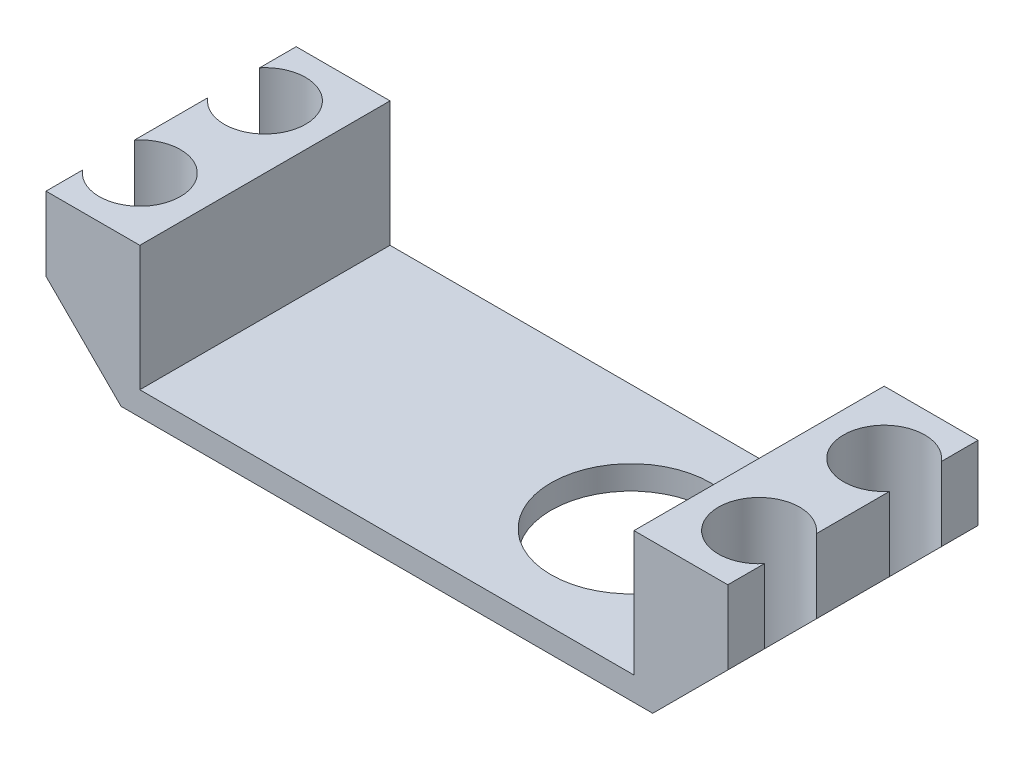
ISO-10303-21;
HEADER;
FILE_DESCRIPTION(('STEP AP214'),'2;1');
FILE_NAME('part.step','',(''),(''),'','','');
FILE_SCHEMA(('AUTOMOTIVE_DESIGN { 1 0 10303 214 1 1 1 1 }'));
ENDSEC;
DATA;
#1=APPLICATION_CONTEXT('core data for automotive mechanical design processes');
#2=APPLICATION_PROTOCOL_DEFINITION('international standard','automotive_design',2000,#1);
#3=PRODUCT_CONTEXT('',#1,'mechanical');
#4=PRODUCT('Part','Part','',(#3));
#5=PRODUCT_RELATED_PRODUCT_CATEGORY('part','',(#4));
#6=PRODUCT_DEFINITION_FORMATION('','',#4);
#7=PRODUCT_DEFINITION_CONTEXT('part definition',#1,'design');
#8=PRODUCT_DEFINITION('design','',#6,#7);
#9=PRODUCT_DEFINITION_SHAPE('','',#8);
#10=(LENGTH_UNIT() NAMED_UNIT(*) SI_UNIT(.MILLI.,.METRE.));
#11=(NAMED_UNIT(*) PLANE_ANGLE_UNIT() SI_UNIT($,.RADIAN.));
#12=(NAMED_UNIT(*) SI_UNIT($,.STERADIAN.) SOLID_ANGLE_UNIT());
#13=UNCERTAINTY_MEASURE_WITH_UNIT(LENGTH_MEASURE(1.E-05),#10,'distance_accuracy_value','');
#14=(GEOMETRIC_REPRESENTATION_CONTEXT(3) GLOBAL_UNCERTAINTY_ASSIGNED_CONTEXT((#13)) GLOBAL_UNIT_ASSIGNED_CONTEXT((#10,
#11,#12)) REPRESENTATION_CONTEXT('',''));
#15=CARTESIAN_POINT('',(0.,0.,0.));
#16=DIRECTION('',(0.,0.,1.));
#17=DIRECTION('',(1.,0.,0.));
#18=AXIS2_PLACEMENT_3D('',#15,#16,#17);
#19=CARTESIAN_POINT('',(27.25,1.,20.));
#20=DIRECTION('',(-1.,0.,0.));
#21=DIRECTION('',(0.,0.,1.));
#22=AXIS2_PLACEMENT_3D('',#19,#20,#21);
#23=PLANE('',#22);
#24=DIRECTION('',(0.,1.,0.));
#25=VECTOR('',#24,1.);
#26=CARTESIAN_POINT('',(27.25,-1.,12.9233440342705));
#27=LINE('',#26,#25);
#28=CARTESIAN_POINT('',(27.25,10.9,12.9233440342705));
#29=VERTEX_POINT('',#28);
#30=CARTESIAN_POINT('',(27.25,5.,12.9233440342705));
#31=VERTEX_POINT('',#30);
#32=EDGE_CURVE('E183',#29,#31,#27,.F.);
#33=ORIENTED_EDGE('',*,*,#32,.T.);
#34=DIRECTION('',(0.,0.,-1.));
#35=VECTOR('',#34,1.);
#36=CARTESIAN_POINT('',(27.25,5.,20.));
#37=LINE('',#36,#35);
#38=CARTESIAN_POINT('',(27.25,5.,7.07665596572954));
#39=VERTEX_POINT('',#38);
#40=EDGE_CURVE('E283',#31,#39,#37,.T.);
#41=ORIENTED_EDGE('',*,*,#40,.T.);
#42=DIRECTION('',(0.,1.,0.));
#43=VECTOR('',#42,1.);
#44=CARTESIAN_POINT('',(27.25,-1.,7.07665596572954));
#45=LINE('',#44,#43);
#46=CARTESIAN_POINT('',(27.25,10.9,7.07665596572954));
#47=VERTEX_POINT('',#46);
#48=EDGE_CURVE('E373',#39,#47,#45,.T.);
#49=ORIENTED_EDGE('',*,*,#48,.T.);
#50=DIRECTION('',(0.,0.,-1.));
#51=VECTOR('',#50,1.);
#52=CARTESIAN_POINT('',(27.25,10.9,20.));
#53=LINE('',#52,#51);
#54=EDGE_CURVE('E242',#29,#47,#53,.T.);
#55=ORIENTED_EDGE('',*,*,#54,.F.);
#56=EDGE_LOOP('',(#33,#41,#49,#55));
#57=FACE_BOUND('',#56,.T.);
#58=ADVANCED_FACE('F47',(#57),#23,.F.);
#59=DIRECTION('',(0.,1.,0.));
#60=VECTOR('',#59,1.);
#61=CARTESIAN_POINT('',(27.25,1.,20.));
#62=LINE('',#61,#60);
#63=CARTESIAN_POINT('',(27.25,5.,20.));
#64=VERTEX_POINT('',#63);
#65=CARTESIAN_POINT('',(27.25,10.9,20.));
#66=VERTEX_POINT('',#65);
#67=EDGE_CURVE('E330',#64,#66,#62,.T.);
#68=ORIENTED_EDGE('',*,*,#67,.F.);
#69=DIRECTION('',(0.,0.,-1.));
#70=VECTOR('',#69,1.);
#71=CARTESIAN_POINT('',(27.25,5.,20.));
#72=LINE('',#71,#70);
#73=CARTESIAN_POINT('',(27.25,5.,17.0766559657295));
#74=VERTEX_POINT('',#73);
#75=EDGE_CURVE('E11',#64,#74,#72,.T.);
#76=ORIENTED_EDGE('',*,*,#75,.T.);
#77=DIRECTION('',(0.,1.,0.));
#78=VECTOR('',#77,1.);
#79=CARTESIAN_POINT('',(27.25,-1.,17.0766559657295));
#80=LINE('',#79,#78);
#81=CARTESIAN_POINT('',(27.25,10.9,17.0766559657295));
#82=VERTEX_POINT('',#81);
#83=EDGE_CURVE('E382',#74,#82,#80,.T.);
#84=ORIENTED_EDGE('',*,*,#83,.T.);
#85=EDGE_CURVE('E237',#66,#82,#53,.T.);
#86=ORIENTED_EDGE('',*,*,#85,.F.);
#87=EDGE_LOOP('',(#68,#76,#84,#86));
#88=FACE_BOUND('',#87,.T.);
#89=ADVANCED_FACE('F447',(#88),#23,.F.);
#90=CARTESIAN_POINT('',(-27.25,1.,20.));
#91=DIRECTION('',(1.,0.,0.));
#92=DIRECTION('',(0.,0.,-1.));
#93=AXIS2_PLACEMENT_3D('',#90,#91,#92);
#94=PLANE('',#93);
#95=DIRECTION('',(0.,1.,0.));
#96=VECTOR('',#95,1.);
#97=CARTESIAN_POINT('',(-27.25,-1.,7.0766559657295));
#98=LINE('',#97,#96);
#99=CARTESIAN_POINT('',(-27.25,10.9,7.0766559657295));
#100=VERTEX_POINT('',#99);
#101=CARTESIAN_POINT('',(-27.25,5.00000000000002,7.0766559657295));
#102=VERTEX_POINT('',#101);
#103=EDGE_CURVE('E184',#100,#102,#98,.F.);
#104=ORIENTED_EDGE('',*,*,#103,.T.);
#105=DIRECTION('',(0.,0.,1.));
#106=VECTOR('',#105,1.);
#107=CARTESIAN_POINT('',(-27.25,5.00000000000002,20.));
#108=LINE('',#107,#106);
#109=CARTESIAN_POINT('',(-27.25,5.00000000000002,12.9233440342705));
#110=VERTEX_POINT('',#109);
#111=EDGE_CURVE('E273',#102,#110,#108,.T.);
#112=ORIENTED_EDGE('',*,*,#111,.T.);
#113=DIRECTION('',(0.,1.,0.));
#114=VECTOR('',#113,1.);
#115=CARTESIAN_POINT('',(-27.25,-1.,12.9233440342705));
#116=LINE('',#115,#114);
#117=CARTESIAN_POINT('',(-27.25,10.9,12.9233440342705));
#118=VERTEX_POINT('',#117);
#119=EDGE_CURVE('E315',#110,#118,#116,.T.);
#120=ORIENTED_EDGE('',*,*,#119,.T.);
#121=DIRECTION('',(0.,0.,-1.));
#122=VECTOR('',#121,1.);
#123=CARTESIAN_POINT('',(-27.25,10.9,20.));
#124=LINE('',#123,#122);
#125=EDGE_CURVE('E202',#118,#100,#124,.T.);
#126=ORIENTED_EDGE('',*,*,#125,.T.);
#127=EDGE_LOOP('',(#104,#112,#120,#126));
#128=FACE_BOUND('',#127,.T.);
#129=ADVANCED_FACE('F430',(#128),#94,.F.);
#130=DIRECTION('',(0.,-1.,0.));
#131=VECTOR('',#130,1.);
#132=CARTESIAN_POINT('',(-27.25,1.,0.));
#133=LINE('',#132,#131);
#134=CARTESIAN_POINT('',(-27.25,10.9,0.));
#135=VERTEX_POINT('',#134);
#136=CARTESIAN_POINT('',(-27.25,5.00000000000002,0.));
#137=VERTEX_POINT('',#136);
#138=EDGE_CURVE('E325',#135,#137,#133,.T.);
#139=ORIENTED_EDGE('',*,*,#138,.T.);
#140=DIRECTION('',(0.,0.,1.));
#141=VECTOR('',#140,1.);
#142=CARTESIAN_POINT('',(-27.25,5.00000000000002,20.));
#143=LINE('',#142,#141);
#144=CARTESIAN_POINT('',(-27.25,5.00000000000002,2.9233440342705));
#145=VERTEX_POINT('',#144);
#146=EDGE_CURVE('E180',#137,#145,#143,.T.);
#147=ORIENTED_EDGE('',*,*,#146,.T.);
#148=DIRECTION('',(0.,1.,0.));
#149=VECTOR('',#148,1.);
#150=CARTESIAN_POINT('',(-27.25,-1.,2.9233440342705));
#151=LINE('',#150,#149);
#152=CARTESIAN_POINT('',(-27.25,10.9,2.9233440342705));
#153=VERTEX_POINT('',#152);
#154=EDGE_CURVE('E172',#145,#153,#151,.T.);
#155=ORIENTED_EDGE('',*,*,#154,.T.);
#156=EDGE_CURVE('E177',#153,#135,#124,.T.);
#157=ORIENTED_EDGE('',*,*,#156,.T.);
#158=EDGE_LOOP('',(#139,#147,#155,#157));
#159=FACE_BOUND('',#158,.T.);
#160=ADVANCED_FACE('F175',(#159),#94,.F.);
#161=DIRECTION('',(0.,1.,0.));
#162=VECTOR('',#161,1.);
#163=CARTESIAN_POINT('',(27.25,-1.,2.92334403427045));
#164=LINE('',#163,#162);
#165=CARTESIAN_POINT('',(27.25,10.9,2.92334403427045));
#166=VERTEX_POINT('',#165);
#167=CARTESIAN_POINT('',(27.25,5.,2.92334403427045));
#168=VERTEX_POINT('',#167);
#169=EDGE_CURVE('E378',#166,#168,#164,.F.);
#170=ORIENTED_EDGE('',*,*,#169,.T.);
#171=DIRECTION('',(0.,0.,-1.));
#172=VECTOR('',#171,1.);
#173=CARTESIAN_POINT('',(27.25,5.,20.));
#174=LINE('',#173,#172);
#175=CARTESIAN_POINT('',(27.25,5.,0.));
#176=VERTEX_POINT('',#175);
#177=EDGE_CURVE('E276',#168,#176,#174,.T.);
#178=ORIENTED_EDGE('',*,*,#177,.T.);
#179=DIRECTION('',(0.,1.,0.));
#180=VECTOR('',#179,1.);
#181=CARTESIAN_POINT('',(27.25,1.,0.));
#182=LINE('',#181,#180);
#183=CARTESIAN_POINT('',(27.25,10.9,0.));
#184=VERTEX_POINT('',#183);
#185=EDGE_CURVE('E306',#176,#184,#182,.T.);
#186=ORIENTED_EDGE('',*,*,#185,.T.);
#187=EDGE_CURVE('E236',#166,#184,#53,.T.);
#188=ORIENTED_EDGE('',*,*,#187,.F.);
#189=EDGE_LOOP('',(#170,#178,#186,#188));
#190=FACE_BOUND('',#189,.T.);
#191=ADVANCED_FACE('F449',(#190),#23,.F.);
#192=CARTESIAN_POINT('',(27.25,10.9,20.));
#193=DIRECTION('',(0.,-1.,0.));
#194=DIRECTION('',(1.,0.,0.));
#195=AXIS2_PLACEMENT_3D('',#192,#193,#194);
#196=PLANE('',#195);
#197=ORIENTED_EDGE('',*,*,#54,.T.);
#198=CARTESIAN_POINT('',(24.75,10.9,4.99999999999999));
#199=DIRECTION('',(0.,1.,0.));
#200=DIRECTION('',(0.,0.,-1.));
#201=AXIS2_PLACEMENT_3D('',#198,#199,#200);
#202=CIRCLE('',#201,3.25);
#203=EDGE_CURVE('E298',#166,#47,#202,.T.);
#204=ORIENTED_EDGE('',*,*,#203,.F.);
#205=ORIENTED_EDGE('',*,*,#187,.T.);
#206=DIRECTION('',(-1.,0.,0.));
#207=VECTOR('',#206,1.);
#208=CARTESIAN_POINT('',(27.25,10.9,0.));
#209=LINE('',#208,#207);
#210=CARTESIAN_POINT('',(19.75,10.9,0.));
#211=VERTEX_POINT('',#210);
#212=EDGE_CURVE('E296',#184,#211,#209,.T.);
#213=ORIENTED_EDGE('',*,*,#212,.T.);
#214=DIRECTION('',(0.,0.,-1.));
#215=VECTOR('',#214,1.);
#216=CARTESIAN_POINT('',(19.75,10.9,20.));
#217=LINE('',#216,#215);
#218=CARTESIAN_POINT('',(19.75,10.9,20.));
#219=VERTEX_POINT('',#218);
#220=EDGE_CURVE('E232',#219,#211,#217,.T.);
#221=ORIENTED_EDGE('',*,*,#220,.F.);
#222=DIRECTION('',(-1.,0.,0.));
#223=VECTOR('',#222,1.);
#224=CARTESIAN_POINT('',(27.25,10.9,20.));
#225=LINE('',#224,#223);
#226=EDGE_CURVE('E333',#66,#219,#225,.T.);
#227=ORIENTED_EDGE('',*,*,#226,.F.);
#228=ORIENTED_EDGE('',*,*,#85,.T.);
#229=CARTESIAN_POINT('',(24.75,10.9,15.));
#230=DIRECTION('',(0.,1.,0.));
#231=DIRECTION('',(0.,0.,1.));
#232=AXIS2_PLACEMENT_3D('',#229,#230,#231);
#233=CIRCLE('',#232,3.25);
#234=EDGE_CURVE('E194',#29,#82,#233,.T.);
#235=ORIENTED_EDGE('',*,*,#234,.F.);
#236=EDGE_LOOP('',(#197,#204,#205,#213,#221,#227,#228,#235));
#237=FACE_BOUND('',#236,.T.);
#238=ADVANCED_FACE('F294',(#237),#196,.F.);
#239=CARTESIAN_POINT('',(19.75,10.9,20.));
#240=DIRECTION('',(1.,0.,0.));
#241=DIRECTION('',(0.,1.,0.));
#242=AXIS2_PLACEMENT_3D('',#239,#240,#241);
#243=PLANE('',#242);
#244=DIRECTION('',(0.,-1.,0.));
#245=VECTOR('',#244,1.);
#246=CARTESIAN_POINT('',(19.75,10.9,0.));
#247=LINE('',#246,#245);
#248=CARTESIAN_POINT('',(19.75,0.900000000000018,0.));
#249=VERTEX_POINT('',#248);
#250=EDGE_CURVE('E308',#211,#249,#247,.T.);
#251=ORIENTED_EDGE('',*,*,#250,.T.);
#252=DIRECTION('',(0.,0.,-1.));
#253=VECTOR('',#252,1.);
#254=CARTESIAN_POINT('',(19.75,0.900000000000018,20.));
#255=LINE('',#254,#253);
#256=CARTESIAN_POINT('',(19.75,0.900000000000018,20.));
#257=VERTEX_POINT('',#256);
#258=EDGE_CURVE('E226',#257,#249,#255,.T.);
#259=ORIENTED_EDGE('',*,*,#258,.F.);
#260=DIRECTION('',(0.,-1.,0.));
#261=VECTOR('',#260,1.);
#262=CARTESIAN_POINT('',(19.75,10.9,20.));
#263=LINE('',#262,#261);
#264=EDGE_CURVE('E338',#219,#257,#263,.T.);
#265=ORIENTED_EDGE('',*,*,#264,.F.);
#266=ORIENTED_EDGE('',*,*,#220,.T.);
#267=EDGE_LOOP('',(#251,#259,#265,#266));
#268=FACE_BOUND('',#267,.T.);
#269=ADVANCED_FACE('F420',(#268),#243,.F.);
#270=CARTESIAN_POINT('',(-19.75,0.900000000000018,20.));
#271=DIRECTION('',(0.,-1.,0.));
#272=DIRECTION('',(0.,0.,-1.));
#273=AXIS2_PLACEMENT_3D('',#270,#271,#272);
#274=PLANE('',#273);
#275=CARTESIAN_POINT('',(9.5,0.900000000000018,10.));
#276=DIRECTION('',(0.,-1.,0.));
#277=DIRECTION('',(0.,0.,-1.));
#278=AXIS2_PLACEMENT_3D('',#275,#276,#277);
#279=CIRCLE('',#278,6.375);
#280=CARTESIAN_POINT('',(9.5,0.900000000000018,3.625));
#281=VERTEX_POINT('',#280);
#282=EDGE_CURVE('E395',#281,#281,#279,.T.);
#283=ORIENTED_EDGE('',*,*,#282,.T.);
#284=EDGE_LOOP('',(#283));
#285=FACE_BOUND('',#284,.T.);
#286=DIRECTION('',(-1.,0.,0.));
#287=VECTOR('',#286,1.);
#288=CARTESIAN_POINT('',(-19.75,0.900000000000018,0.));
#289=LINE('',#288,#287);
#290=CARTESIAN_POINT('',(-19.75,0.900000000000018,0.));
#291=VERTEX_POINT('',#290);
#292=EDGE_CURVE('E313',#249,#291,#289,.T.);
#293=ORIENTED_EDGE('',*,*,#292,.T.);
#294=DIRECTION('',(0.,0.,-1.));
#295=VECTOR('',#294,1.);
#296=CARTESIAN_POINT('',(-19.75,0.900000000000018,20.));
#297=LINE('',#296,#295);
#298=CARTESIAN_POINT('',(-19.75,0.900000000000018,20.));
#299=VERTEX_POINT('',#298);
#300=EDGE_CURVE('E221',#299,#291,#297,.T.);
#301=ORIENTED_EDGE('',*,*,#300,.F.);
#302=DIRECTION('',(-1.,0.,0.));
#303=VECTOR('',#302,1.);
#304=CARTESIAN_POINT('',(-19.75,0.900000000000018,20.));
#305=LINE('',#304,#303);
#306=EDGE_CURVE('E345',#257,#299,#305,.T.);
#307=ORIENTED_EDGE('',*,*,#306,.F.);
#308=ORIENTED_EDGE('',*,*,#258,.T.);
#309=EDGE_LOOP('',(#293,#301,#307,#308));
#310=FACE_BOUND('',#309,.T.);
#311=ADVANCED_FACE('F416',(#285,#310),#274,.F.);
#312=CARTESIAN_POINT('',(-19.75,10.9,20.));
#313=DIRECTION('',(-1.,0.,0.));
#314=DIRECTION('',(0.,0.,1.));
#315=AXIS2_PLACEMENT_3D('',#312,#313,#314);
#316=PLANE('',#315);
#317=DIRECTION('',(0.,1.,0.));
#318=VECTOR('',#317,1.);
#319=CARTESIAN_POINT('',(-19.75,10.9,0.));
#320=LINE('',#319,#318);
#321=CARTESIAN_POINT('',(-19.75,10.9,0.));
#322=VERTEX_POINT('',#321);
#323=EDGE_CURVE('E320',#291,#322,#320,.T.);
#324=ORIENTED_EDGE('',*,*,#323,.T.);
#325=DIRECTION('',(0.,0.,-1.));
#326=VECTOR('',#325,1.);
#327=CARTESIAN_POINT('',(-19.75,10.9,20.));
#328=LINE('',#327,#326);
#329=CARTESIAN_POINT('',(-19.75,10.9,20.));
#330=VERTEX_POINT('',#329);
#331=EDGE_CURVE('E215',#330,#322,#328,.T.);
#332=ORIENTED_EDGE('',*,*,#331,.F.);
#333=DIRECTION('',(0.,1.,0.));
#334=VECTOR('',#333,1.);
#335=CARTESIAN_POINT('',(-19.75,10.9,20.));
#336=LINE('',#335,#334);
#337=EDGE_CURVE('E348',#299,#330,#336,.T.);
#338=ORIENTED_EDGE('',*,*,#337,.F.);
#339=ORIENTED_EDGE('',*,*,#300,.T.);
#340=EDGE_LOOP('',(#324,#332,#338,#339));
#341=FACE_BOUND('',#340,.T.);
#342=ADVANCED_FACE('F419',(#341),#316,.F.);
#343=CARTESIAN_POINT('',(-27.25,10.9,20.));
#344=DIRECTION('',(0.,-1.,0.));
#345=DIRECTION('',(0.,0.,-1.));
#346=AXIS2_PLACEMENT_3D('',#343,#344,#345);
#347=PLANE('',#346);
#348=ORIENTED_EDGE('',*,*,#125,.F.);
#349=CARTESIAN_POINT('',(-24.75,10.9,15.));
#350=DIRECTION('',(0.,1.,0.));
#351=DIRECTION('',(0.,0.,-1.));
#352=AXIS2_PLACEMENT_3D('',#349,#350,#351);
#353=CIRCLE('',#352,3.25);
#354=CARTESIAN_POINT('',(-27.25,10.9,17.0766559657295));
#355=VERTEX_POINT('',#354);
#356=EDGE_CURVE('E391',#355,#118,#353,.T.);
#357=ORIENTED_EDGE('',*,*,#356,.F.);
#358=CARTESIAN_POINT('',(-27.25,10.9,20.));
#359=VERTEX_POINT('',#358);
#360=EDGE_CURVE('E205',#359,#355,#124,.T.);
#361=ORIENTED_EDGE('',*,*,#360,.F.);
#362=DIRECTION('',(-1.,0.,0.));
#363=VECTOR('',#362,1.);
#364=CARTESIAN_POINT('',(-27.25,10.9,20.));
#365=LINE('',#364,#363);
#366=EDGE_CURVE('E351',#330,#359,#365,.T.);
#367=ORIENTED_EDGE('',*,*,#366,.F.);
#368=ORIENTED_EDGE('',*,*,#331,.T.);
#369=DIRECTION('',(-1.,0.,0.));
#370=VECTOR('',#369,1.);
#371=CARTESIAN_POINT('',(-27.25,10.9,0.));
#372=LINE('',#371,#370);
#373=EDGE_CURVE('E200',#322,#135,#372,.T.);
#374=ORIENTED_EDGE('',*,*,#373,.T.);
#375=ORIENTED_EDGE('',*,*,#156,.F.);
#376=CARTESIAN_POINT('',(-24.75,10.9,5.));
#377=DIRECTION('',(0.,1.,0.));
#378=DIRECTION('',(0.,0.,1.));
#379=AXIS2_PLACEMENT_3D('',#376,#377,#378);
#380=CIRCLE('',#379,3.25);
#381=EDGE_CURVE('E187',#100,#153,#380,.T.);
#382=ORIENTED_EDGE('',*,*,#381,.F.);
#383=EDGE_LOOP('',(#348,#357,#361,#367,#368,#374,#375,#382));
#384=FACE_BOUND('',#383,.T.);
#385=ADVANCED_FACE('F197',(#384),#347,.F.);
#386=DIRECTION('',(0.,1.,0.));
#387=VECTOR('',#386,1.);
#388=CARTESIAN_POINT('',(-27.25,-1.,17.0766559657295));
#389=LINE('',#388,#387);
#390=CARTESIAN_POINT('',(-27.25,5.00000000000002,17.0766559657295));
#391=VERTEX_POINT('',#390);
#392=EDGE_CURVE('E377',#355,#391,#389,.F.);
#393=ORIENTED_EDGE('',*,*,#392,.T.);
#394=DIRECTION('',(0.,0.,1.));
#395=VECTOR('',#394,1.);
#396=CARTESIAN_POINT('',(-27.25,5.00000000000002,20.));
#397=LINE('',#396,#395);
#398=CARTESIAN_POINT('',(-27.25,5.00000000000002,20.));
#399=VERTEX_POINT('',#398);
#400=EDGE_CURVE('E263',#391,#399,#397,.T.);
#401=ORIENTED_EDGE('',*,*,#400,.T.);
#402=DIRECTION('',(0.,-1.,0.));
#403=VECTOR('',#402,1.);
#404=CARTESIAN_POINT('',(-27.25,1.,20.));
#405=LINE('',#404,#403);
#406=EDGE_CURVE('E209',#359,#399,#405,.T.);
#407=ORIENTED_EDGE('',*,*,#406,.F.);
#408=ORIENTED_EDGE('',*,*,#360,.T.);
#409=EDGE_LOOP('',(#393,#401,#407,#408));
#410=FACE_BOUND('',#409,.T.);
#411=ADVANCED_FACE('F435',(#410),#94,.F.);
#412=CARTESIAN_POINT('',(-27.25,-1.,20.));
#413=DIRECTION('',(0.,1.,0.));
#414=DIRECTION('',(0.,0.,1.));
#415=AXIS2_PLACEMENT_3D('',#412,#413,#414);
#416=PLANE('',#415);
#417=CARTESIAN_POINT('',(9.5,-1.,10.));
#418=DIRECTION('',(0.,1.,0.));
#419=DIRECTION('',(0.,0.,1.));
#420=AXIS2_PLACEMENT_3D('',#417,#418,#419);
#421=CIRCLE('',#420,6.375);
#422=CARTESIAN_POINT('',(9.5,-1.,16.375));
#423=VERTEX_POINT('',#422);
#424=EDGE_CURVE('E404',#423,#423,#421,.T.);
#425=ORIENTED_EDGE('',*,*,#424,.T.);
#426=EDGE_LOOP('',(#425));
#427=FACE_BOUND('',#426,.T.);
#428=DIRECTION('',(0.,0.,-1.));
#429=VECTOR('',#428,1.);
#430=CARTESIAN_POINT('',(-21.25,-1.,20.));
#431=LINE('',#430,#429);
#432=CARTESIAN_POINT('',(-21.25,-1.,20.));
#433=VERTEX_POINT('',#432);
#434=CARTESIAN_POINT('',(-21.25,-1.,0.));
#435=VERTEX_POINT('',#434);
#436=EDGE_CURVE('E245',#433,#435,#431,.T.);
#437=ORIENTED_EDGE('',*,*,#436,.T.);
#438=DIRECTION('',(1.,0.,0.));
#439=VECTOR('',#438,1.);
#440=CARTESIAN_POINT('',(-27.25,-1.,0.));
#441=LINE('',#440,#439);
#442=CARTESIAN_POINT('',(21.25,-1.,0.));
#443=VERTEX_POINT('',#442);
#444=EDGE_CURVE('E327',#435,#443,#441,.T.);
#445=ORIENTED_EDGE('',*,*,#444,.T.);
#446=DIRECTION('',(0.,0.,1.));
#447=VECTOR('',#446,1.);
#448=CARTESIAN_POINT('',(21.25,-1.,20.));
#449=LINE('',#448,#447);
#450=CARTESIAN_POINT('',(21.25,-1.,20.));
#451=VERTEX_POINT('',#450);
#452=EDGE_CURVE('E241',#443,#451,#449,.T.);
#453=ORIENTED_EDGE('',*,*,#452,.T.);
#454=DIRECTION('',(1.,0.,0.));
#455=VECTOR('',#454,1.);
#456=CARTESIAN_POINT('',(-27.25,-1.,20.));
#457=LINE('',#456,#455);
#458=EDGE_CURVE('E203',#433,#451,#457,.T.);
#459=ORIENTED_EDGE('',*,*,#458,.F.);
#460=EDGE_LOOP('',(#437,#445,#453,#459));
#461=FACE_BOUND('',#460,.T.);
#462=ADVANCED_FACE('F364',(#427,#461),#416,.F.);
#463=CARTESIAN_POINT('',(0.,0.,20.));
#464=DIRECTION('',(0.,0.,1.));
#465=DIRECTION('',(1.,0.,0.));
#466=AXIS2_PLACEMENT_3D('',#463,#464,#465);
#467=PLANE('',#466);
#468=ORIENTED_EDGE('',*,*,#406,.T.);
#469=DIRECTION('',(-0.707106781186547,0.707106781186548,0.));
#470=VECTOR('',#469,1.);
#471=CARTESIAN_POINT('',(-11.125,-11.125,20.));
#472=LINE('',#471,#470);
#473=EDGE_CURVE('E269',#399,#433,#472,.F.);
#474=ORIENTED_EDGE('',*,*,#473,.T.);
#475=ORIENTED_EDGE('',*,*,#458,.T.);
#476=DIRECTION('',(-0.707106781186549,-0.707106781186546,0.));
#477=VECTOR('',#476,1.);
#478=CARTESIAN_POINT('',(11.1249999999999,-11.125,20.));
#479=LINE('',#478,#477);
#480=EDGE_CURVE('E266',#451,#64,#479,.F.);
#481=ORIENTED_EDGE('',*,*,#480,.T.);
#482=ORIENTED_EDGE('',*,*,#67,.T.);
#483=ORIENTED_EDGE('',*,*,#226,.T.);
#484=ORIENTED_EDGE('',*,*,#264,.T.);
#485=ORIENTED_EDGE('',*,*,#306,.T.);
#486=ORIENTED_EDGE('',*,*,#337,.T.);
#487=ORIENTED_EDGE('',*,*,#366,.T.);
#488=EDGE_LOOP('',(#468,#474,#475,#481,#482,#483,#484,#485,#486,#487));
#489=FACE_BOUND('',#488,.T.);
#490=ADVANCED_FACE('F357',(#489),#467,.T.);
#491=CARTESIAN_POINT('',(0.,0.,0.));
#492=DIRECTION('',(0.,0.,1.));
#493=DIRECTION('',(1.,0.,0.));
#494=AXIS2_PLACEMENT_3D('',#491,#492,#493);
#495=PLANE('',#494);
#496=ORIENTED_EDGE('',*,*,#444,.F.);
#497=DIRECTION('',(0.707106781186547,-0.707106781186548,0.));
#498=VECTOR('',#497,1.);
#499=CARTESIAN_POINT('',(-21.25,-1.,0.));
#500=LINE('',#499,#498);
#501=EDGE_CURVE('E252',#435,#137,#500,.F.);
#502=ORIENTED_EDGE('',*,*,#501,.T.);
#503=ORIENTED_EDGE('',*,*,#138,.F.);
#504=ORIENTED_EDGE('',*,*,#373,.F.);
#505=ORIENTED_EDGE('',*,*,#323,.F.);
#506=ORIENTED_EDGE('',*,*,#292,.F.);
#507=ORIENTED_EDGE('',*,*,#250,.F.);
#508=ORIENTED_EDGE('',*,*,#212,.F.);
#509=ORIENTED_EDGE('',*,*,#185,.F.);
#510=DIRECTION('',(0.707106781186549,0.707106781186546,0.));
#511=VECTOR('',#510,1.);
#512=CARTESIAN_POINT('',(27.25,5.,0.));
#513=LINE('',#512,#511);
#514=EDGE_CURVE('E248',#176,#443,#513,.F.);
#515=ORIENTED_EDGE('',*,*,#514,.T.);
#516=EDGE_LOOP('',(#496,#502,#503,#504,#505,#506,#507,#508,#509,#515));
#517=FACE_BOUND('',#516,.T.);
#518=ADVANCED_FACE('F305',(#517),#495,.F.);
#519=CARTESIAN_POINT('',(-24.75,-1.,5.));
#520=DIRECTION('',(0.,1.,0.));
#521=DIRECTION('',(0.,0.,1.));
#522=AXIS2_PLACEMENT_3D('',#519,#520,#521);
#523=CYLINDRICAL_SURFACE('',#522,3.25);
#524=ORIENTED_EDGE('',*,*,#154,.F.);
#525=CARTESIAN_POINT('',(-24.75,2.5,5.));
#526=DIRECTION('',(0.707106781186548,0.707106781186547,0.));
#527=DIRECTION('',(-0.707106781186547,0.707106781186548,0.));
#528=AXIS2_PLACEMENT_3D('',#525,#526,#527);
#529=ELLIPSE('',#528,4.59619407771256,3.25);
#530=EDGE_CURVE('E257',#145,#102,#529,.F.);
#531=ORIENTED_EDGE('',*,*,#530,.T.);
#532=ORIENTED_EDGE('',*,*,#103,.F.);
#533=ORIENTED_EDGE('',*,*,#381,.T.);
#534=EDGE_LOOP('',(#524,#531,#532,#533));
#535=FACE_BOUND('',#534,.T.);
#536=ADVANCED_FACE('F188',(#535),#523,.F.);
#537=CARTESIAN_POINT('',(24.75,-1.,15.));
#538=DIRECTION('',(0.,1.,0.));
#539=DIRECTION('',(0.,0.,1.));
#540=AXIS2_PLACEMENT_3D('',#537,#538,#539);
#541=CYLINDRICAL_SURFACE('',#540,3.25);
#542=CARTESIAN_POINT('',(24.75,2.50000000000003,15.));
#543=DIRECTION('',(-0.707106781186546,0.707106781186549,0.));
#544=DIRECTION('',(0.707106781186549,0.707106781186546,0.));
#545=AXIS2_PLACEMENT_3D('',#542,#543,#544);
#546=ELLIPSE('',#545,4.59619407771255,3.25);
#547=EDGE_CURVE('E57',#74,#31,#546,.F.);
#548=ORIENTED_EDGE('',*,*,#547,.T.);
#549=ORIENTED_EDGE('',*,*,#32,.F.);
#550=ORIENTED_EDGE('',*,*,#234,.T.);
#551=ORIENTED_EDGE('',*,*,#83,.F.);
#552=EDGE_LOOP('',(#548,#549,#550,#551));
#553=FACE_BOUND('',#552,.T.);
#554=ADVANCED_FACE('F527',(#553),#541,.F.);
#555=CARTESIAN_POINT('',(24.75,-1.,4.99999999999999));
#556=DIRECTION('',(0.,1.,0.));
#557=DIRECTION('',(0.,0.,1.));
#558=AXIS2_PLACEMENT_3D('',#555,#556,#557);
#559=CYLINDRICAL_SURFACE('',#558,3.25);
#560=CARTESIAN_POINT('',(24.75,2.50000000000003,4.99999999999999));
#561=DIRECTION('',(-0.707106781186546,0.707106781186549,0.));
#562=DIRECTION('',(0.707106781186549,0.707106781186546,0.));
#563=AXIS2_PLACEMENT_3D('',#560,#561,#562);
#564=ELLIPSE('',#563,4.59619407771255,3.25);
#565=EDGE_CURVE('E280',#39,#168,#564,.F.);
#566=ORIENTED_EDGE('',*,*,#565,.T.);
#567=ORIENTED_EDGE('',*,*,#169,.F.);
#568=ORIENTED_EDGE('',*,*,#203,.T.);
#569=ORIENTED_EDGE('',*,*,#48,.F.);
#570=EDGE_LOOP('',(#566,#567,#568,#569));
#571=FACE_BOUND('',#570,.T.);
#572=ADVANCED_FACE('F375',(#571),#559,.F.);
#573=CARTESIAN_POINT('',(-24.75,-1.,15.));
#574=DIRECTION('',(0.,1.,0.));
#575=DIRECTION('',(0.,0.,1.));
#576=AXIS2_PLACEMENT_3D('',#573,#574,#575);
#577=CYLINDRICAL_SURFACE('',#576,3.25);
#578=CARTESIAN_POINT('',(-24.75,2.5,15.));
#579=DIRECTION('',(0.707106781186548,0.707106781186547,0.));
#580=DIRECTION('',(-0.707106781186547,0.707106781186548,0.));
#581=AXIS2_PLACEMENT_3D('',#578,#579,#580);
#582=ELLIPSE('',#581,4.59619407771256,3.25);
#583=EDGE_CURVE('E260',#110,#391,#582,.F.);
#584=ORIENTED_EDGE('',*,*,#583,.T.);
#585=ORIENTED_EDGE('',*,*,#392,.F.);
#586=ORIENTED_EDGE('',*,*,#356,.T.);
#587=ORIENTED_EDGE('',*,*,#119,.F.);
#588=EDGE_LOOP('',(#584,#585,#586,#587));
#589=FACE_BOUND('',#588,.T.);
#590=ADVANCED_FACE('F434',(#589),#577,.F.);
#591=CARTESIAN_POINT('',(-21.25,-1.,20.));
#592=DIRECTION('',(0.707106781186548,0.707106781186547,0.));
#593=DIRECTION('',(0.,0.,-1.));
#594=AXIS2_PLACEMENT_3D('',#591,#592,#593);
#595=PLANE('',#594);
#596=ORIENTED_EDGE('',*,*,#400,.F.);
#597=ORIENTED_EDGE('',*,*,#583,.F.);
#598=ORIENTED_EDGE('',*,*,#111,.F.);
#599=ORIENTED_EDGE('',*,*,#530,.F.);
#600=ORIENTED_EDGE('',*,*,#146,.F.);
#601=ORIENTED_EDGE('',*,*,#501,.F.);
#602=ORIENTED_EDGE('',*,*,#436,.F.);
#603=ORIENTED_EDGE('',*,*,#473,.F.);
#604=EDGE_LOOP('',(#596,#597,#598,#599,#600,#601,#602,#603));
#605=FACE_BOUND('',#604,.T.);
#606=ADVANCED_FACE('F361',(#605),#595,.F.);
#607=CARTESIAN_POINT('',(27.25,5.,20.));
#608=DIRECTION('',(-0.707106781186546,0.707106781186549,0.));
#609=DIRECTION('',(0.,0.,-1.));
#610=AXIS2_PLACEMENT_3D('',#607,#608,#609);
#611=PLANE('',#610);
#612=ORIENTED_EDGE('',*,*,#480,.F.);
#613=ORIENTED_EDGE('',*,*,#452,.F.);
#614=ORIENTED_EDGE('',*,*,#514,.F.);
#615=ORIENTED_EDGE('',*,*,#177,.F.);
#616=ORIENTED_EDGE('',*,*,#565,.F.);
#617=ORIENTED_EDGE('',*,*,#40,.F.);
#618=ORIENTED_EDGE('',*,*,#547,.F.);
#619=ORIENTED_EDGE('',*,*,#75,.F.);
#620=EDGE_LOOP('',(#612,#613,#614,#615,#616,#617,#618,#619));
#621=FACE_BOUND('',#620,.T.);
#622=ADVANCED_FACE('F50',(#621),#611,.F.);
#623=CARTESIAN_POINT('',(9.5,-1.,10.));
#624=DIRECTION('',(0.,1.,0.));
#625=DIRECTION('',(0.,0.,1.));
#626=AXIS2_PLACEMENT_3D('',#623,#624,#625);
#627=CYLINDRICAL_SURFACE('',#626,6.375);
#628=ORIENTED_EDGE('',*,*,#424,.F.);
#629=EDGE_LOOP('',(#628));
#630=FACE_BOUND('',#629,.T.);
#631=ORIENTED_EDGE('',*,*,#282,.F.);
#632=EDGE_LOOP('',(#631));
#633=FACE_BOUND('',#632,.T.);
#634=ADVANCED_FACE('F410',(#630,#633),#627,.F.);
#635=CLOSED_SHELL('',(#58,#89,#129,#160,#191,#238,#269,#311,#342,#385,#411,#462,#490,#518,#536,
#554,#572,#590,#606,#622,#634));
#636=MANIFOLD_SOLID_BREP('B2',#635);
#637=ADVANCED_BREP_SHAPE_REPRESENTATION('',(#18,#636),#14);
#638=SHAPE_DEFINITION_REPRESENTATION(#9,#637);
ENDSEC;
END-ISO-10303-21;
